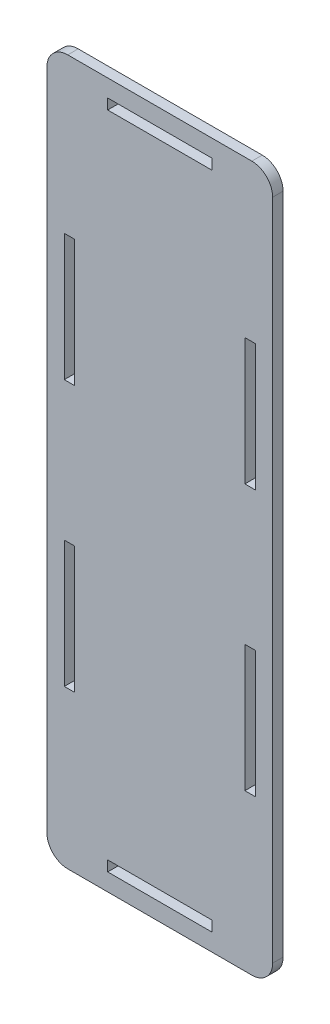
ISO-10303-21;
HEADER;
FILE_DESCRIPTION(('STEP AP214'),'2;1');
FILE_NAME('part.step','',(''),(''),'','','');
FILE_SCHEMA(('AUTOMOTIVE_DESIGN { 1 0 10303 214 1 1 1 1 }'));
ENDSEC;
DATA;
#1=APPLICATION_CONTEXT('core data for automotive mechanical design processes');
#2=APPLICATION_PROTOCOL_DEFINITION('international standard','automotive_design',2000,#1);
#3=PRODUCT_CONTEXT('',#1,'mechanical');
#4=PRODUCT('Part','Part','',(#3));
#5=PRODUCT_RELATED_PRODUCT_CATEGORY('part','',(#4));
#6=PRODUCT_DEFINITION_FORMATION('','',#4);
#7=PRODUCT_DEFINITION_CONTEXT('part definition',#1,'design');
#8=PRODUCT_DEFINITION('design','',#6,#7);
#9=PRODUCT_DEFINITION_SHAPE('','',#8);
#10=(LENGTH_UNIT() NAMED_UNIT(*) SI_UNIT(.MILLI.,.METRE.));
#11=(NAMED_UNIT(*) PLANE_ANGLE_UNIT() SI_UNIT($,.RADIAN.));
#12=(NAMED_UNIT(*) SI_UNIT($,.STERADIAN.) SOLID_ANGLE_UNIT());
#13=UNCERTAINTY_MEASURE_WITH_UNIT(LENGTH_MEASURE(1.E-05),#10,'distance_accuracy_value','');
#14=(GEOMETRIC_REPRESENTATION_CONTEXT(3) GLOBAL_UNCERTAINTY_ASSIGNED_CONTEXT((#13)) GLOBAL_UNIT_ASSIGNED_CONTEXT((#10,
#11,#12)) REPRESENTATION_CONTEXT('',''));
#15=CARTESIAN_POINT('',(0.,0.,0.));
#16=DIRECTION('',(0.,0.,1.));
#17=DIRECTION('',(1.,0.,0.));
#18=AXIS2_PLACEMENT_3D('',#15,#16,#17);
#19=CARTESIAN_POINT('',(26.5,95.5,3.));
#20=DIRECTION('',(0.,0.,-1.));
#21=DIRECTION('',(-1.,0.,0.));
#22=AXIS2_PLACEMENT_3D('',#19,#20,#21);
#23=PLANE('',#22);
#24=DIRECTION('',(0.,1.,0.));
#25=VECTOR('',#24,1.);
#26=CARTESIAN_POINT('',(-15.,-96.5,3.));
#27=LINE('',#26,#25);
#28=CARTESIAN_POINT('',(-15.,-96.5,3.));
#29=VERTEX_POINT('',#28);
#30=CARTESIAN_POINT('',(-15.,-93.5,3.));
#31=VERTEX_POINT('',#30);
#32=EDGE_CURVE('E56',#29,#31,#27,.T.);
#33=ORIENTED_EDGE('',*,*,#32,.T.);
#34=DIRECTION('',(1.,0.,0.));
#35=VECTOR('',#34,1.);
#36=CARTESIAN_POINT('',(-15.,-93.5,3.));
#37=LINE('',#36,#35);
#38=CARTESIAN_POINT('',(15.,-93.5,3.));
#39=VERTEX_POINT('',#38);
#40=EDGE_CURVE('E364',#31,#39,#37,.T.);
#41=ORIENTED_EDGE('',*,*,#40,.T.);
#42=DIRECTION('',(0.,1.,0.));
#43=VECTOR('',#42,1.);
#44=CARTESIAN_POINT('',(15.,-96.5,3.));
#45=LINE('',#44,#43);
#46=CARTESIAN_POINT('',(15.,-96.5,3.));
#47=VERTEX_POINT('',#46);
#48=EDGE_CURVE('E360',#47,#39,#45,.T.);
#49=ORIENTED_EDGE('',*,*,#48,.F.);
#50=DIRECTION('',(1.,0.,0.));
#51=VECTOR('',#50,1.);
#52=CARTESIAN_POINT('',(-15.,-96.5,3.));
#53=LINE('',#52,#51);
#54=EDGE_CURVE('E357',#29,#47,#53,.T.);
#55=ORIENTED_EDGE('',*,*,#54,.F.);
#56=EDGE_LOOP('',(#33,#41,#49,#55));
#57=FACE_BOUND('',#56,.T.);
#58=DIRECTION('',(0.,1.,0.));
#59=VECTOR('',#58,1.);
#60=CARTESIAN_POINT('',(27.5,-56.5,3.));
#61=LINE('',#60,#59);
#62=CARTESIAN_POINT('',(27.5,-56.5,3.));
#63=VERTEX_POINT('',#62);
#64=CARTESIAN_POINT('',(27.5,-20.,3.));
#65=VERTEX_POINT('',#64);
#66=EDGE_CURVE('E335',#63,#65,#61,.T.);
#67=ORIENTED_EDGE('',*,*,#66,.F.);
#68=DIRECTION('',(1.,0.,0.));
#69=VECTOR('',#68,1.);
#70=CARTESIAN_POINT('',(24.5,-56.5,3.));
#71=LINE('',#70,#69);
#72=CARTESIAN_POINT('',(24.5,-56.5,3.));
#73=VERTEX_POINT('',#72);
#74=EDGE_CURVE('E290',#73,#63,#71,.T.);
#75=ORIENTED_EDGE('',*,*,#74,.F.);
#76=DIRECTION('',(0.,1.,0.));
#77=VECTOR('',#76,1.);
#78=CARTESIAN_POINT('',(24.5,-56.5,3.));
#79=LINE('',#78,#77);
#80=CARTESIAN_POINT('',(24.5,-20.,3.));
#81=VERTEX_POINT('',#80);
#82=EDGE_CURVE('E328',#73,#81,#79,.T.);
#83=ORIENTED_EDGE('',*,*,#82,.T.);
#84=DIRECTION('',(1.,0.,0.));
#85=VECTOR('',#84,1.);
#86=CARTESIAN_POINT('',(24.5,-20.,3.));
#87=LINE('',#86,#85);
#88=EDGE_CURVE('E331',#81,#65,#87,.T.);
#89=ORIENTED_EDGE('',*,*,#88,.T.);
#90=EDGE_LOOP('',(#67,#75,#83,#89));
#91=FACE_BOUND('',#90,.T.);
#92=CARTESIAN_POINT('',(26.5,95.5,3.));
#93=DIRECTION('',(0.,0.,1.));
#94=DIRECTION('',(-1.,0.,0.));
#95=AXIS2_PLACEMENT_3D('',#92,#93,#94);
#96=CIRCLE('',#95,6.);
#97=CARTESIAN_POINT('',(32.5,95.5,3.));
#98=VERTEX_POINT('',#97);
#99=CARTESIAN_POINT('',(26.4999999999999,101.5,3.));
#100=VERTEX_POINT('',#99);
#101=EDGE_CURVE('E433',#98,#100,#96,.T.);
#102=ORIENTED_EDGE('',*,*,#101,.T.);
#103=DIRECTION('',(-1.,0.,0.));
#104=VECTOR('',#103,1.);
#105=CARTESIAN_POINT('',(-26.5,101.5,3.));
#106=LINE('',#105,#104);
#107=CARTESIAN_POINT('',(-26.5,101.5,3.));
#108=VERTEX_POINT('',#107);
#109=EDGE_CURVE('E436',#100,#108,#106,.T.);
#110=ORIENTED_EDGE('',*,*,#109,.T.);
#111=CARTESIAN_POINT('',(-26.5,95.5,3.));
#112=DIRECTION('',(0.,0.,1.));
#113=DIRECTION('',(-1.,0.,0.));
#114=AXIS2_PLACEMENT_3D('',#111,#112,#113);
#115=CIRCLE('',#114,6.);
#116=CARTESIAN_POINT('',(-32.5,95.5,3.));
#117=VERTEX_POINT('',#116);
#118=EDGE_CURVE('E439',#108,#117,#115,.T.);
#119=ORIENTED_EDGE('',*,*,#118,.T.);
#120=DIRECTION('',(0.,-1.,0.));
#121=VECTOR('',#120,1.);
#122=CARTESIAN_POINT('',(-32.5,95.5,3.));
#123=LINE('',#122,#121);
#124=CARTESIAN_POINT('',(-32.5,-95.5,3.));
#125=VERTEX_POINT('',#124);
#126=EDGE_CURVE('E441',#117,#125,#123,.T.);
#127=ORIENTED_EDGE('',*,*,#126,.T.);
#128=CARTESIAN_POINT('',(-26.5,-95.5,3.));
#129=DIRECTION('',(0.,0.,1.));
#130=DIRECTION('',(-1.,0.,0.));
#131=AXIS2_PLACEMENT_3D('',#128,#129,#130);
#132=CIRCLE('',#131,6.);
#133=CARTESIAN_POINT('',(-26.5,-101.5,3.));
#134=VERTEX_POINT('',#133);
#135=EDGE_CURVE('E443',#125,#134,#132,.T.);
#136=ORIENTED_EDGE('',*,*,#135,.T.);
#137=DIRECTION('',(1.,0.,0.));
#138=VECTOR('',#137,1.);
#139=CARTESIAN_POINT('',(-26.5,-101.5,3.));
#140=LINE('',#139,#138);
#141=CARTESIAN_POINT('',(26.5,-101.5,3.));
#142=VERTEX_POINT('',#141);
#143=EDGE_CURVE('E445',#134,#142,#140,.T.);
#144=ORIENTED_EDGE('',*,*,#143,.T.);
#145=CARTESIAN_POINT('',(26.5,-95.5,3.));
#146=DIRECTION('',(0.,0.,1.));
#147=DIRECTION('',(1.,0.,0.));
#148=AXIS2_PLACEMENT_3D('',#145,#146,#147);
#149=CIRCLE('',#148,6.);
#150=CARTESIAN_POINT('',(32.5,-95.5,3.));
#151=VERTEX_POINT('',#150);
#152=EDGE_CURVE('E447',#142,#151,#149,.T.);
#153=ORIENTED_EDGE('',*,*,#152,.T.);
#154=DIRECTION('',(0.,1.,0.));
#155=VECTOR('',#154,1.);
#156=CARTESIAN_POINT('',(32.5,95.5,3.));
#157=LINE('',#156,#155);
#158=EDGE_CURVE('E449',#151,#98,#157,.T.);
#159=ORIENTED_EDGE('',*,*,#158,.T.);
#160=EDGE_LOOP('',(#102,#110,#119,#127,#136,#144,#153,#159));
#161=FACE_BOUND('',#160,.T.);
#162=DIRECTION('',(0.,-1.,0.));
#163=VECTOR('',#162,1.);
#164=CARTESIAN_POINT('',(-27.5,56.5,3.));
#165=LINE('',#164,#163);
#166=CARTESIAN_POINT('',(-27.5,56.5,3.));
#167=VERTEX_POINT('',#166);
#168=CARTESIAN_POINT('',(-27.5,20.,3.));
#169=VERTEX_POINT('',#168);
#170=EDGE_CURVE('E271',#167,#169,#165,.T.);
#171=ORIENTED_EDGE('',*,*,#170,.F.);
#172=DIRECTION('',(-1.,0.,0.));
#173=VECTOR('',#172,1.);
#174=CARTESIAN_POINT('',(-24.5,56.5,3.));
#175=LINE('',#174,#173);
#176=CARTESIAN_POINT('',(-24.5,56.5,3.));
#177=VERTEX_POINT('',#176);
#178=EDGE_CURVE('E269',#177,#167,#175,.T.);
#179=ORIENTED_EDGE('',*,*,#178,.F.);
#180=DIRECTION('',(0.,-1.,0.));
#181=VECTOR('',#180,1.);
#182=CARTESIAN_POINT('',(-24.5,56.5,3.));
#183=LINE('',#182,#181);
#184=CARTESIAN_POINT('',(-24.5,20.,3.));
#185=VERTEX_POINT('',#184);
#186=EDGE_CURVE('E408',#177,#185,#183,.T.);
#187=ORIENTED_EDGE('',*,*,#186,.T.);
#188=DIRECTION('',(-1.,0.,0.));
#189=VECTOR('',#188,1.);
#190=CARTESIAN_POINT('',(-24.5,20.,3.));
#191=LINE('',#190,#189);
#192=EDGE_CURVE('E419',#185,#169,#191,.T.);
#193=ORIENTED_EDGE('',*,*,#192,.T.);
#194=EDGE_LOOP('',(#171,#179,#187,#193));
#195=FACE_BOUND('',#194,.T.);
#196=DIRECTION('',(1.,0.,0.));
#197=VECTOR('',#196,1.);
#198=CARTESIAN_POINT('',(-15.,93.5,3.));
#199=LINE('',#198,#197);
#200=CARTESIAN_POINT('',(-15.,93.5,3.));
#201=VERTEX_POINT('',#200);
#202=CARTESIAN_POINT('',(15.,93.5,3.));
#203=VERTEX_POINT('',#202);
#204=EDGE_CURVE('E268',#201,#203,#199,.T.);
#205=ORIENTED_EDGE('',*,*,#204,.F.);
#206=DIRECTION('',(0.,-1.,0.));
#207=VECTOR('',#206,1.);
#208=CARTESIAN_POINT('',(-15.,96.5,3.));
#209=LINE('',#208,#207);
#210=CARTESIAN_POINT('',(-15.,96.5,3.));
#211=VERTEX_POINT('',#210);
#212=EDGE_CURVE('E247',#211,#201,#209,.T.);
#213=ORIENTED_EDGE('',*,*,#212,.F.);
#214=DIRECTION('',(1.,0.,0.));
#215=VECTOR('',#214,1.);
#216=CARTESIAN_POINT('',(-15.,96.5,3.));
#217=LINE('',#216,#215);
#218=CARTESIAN_POINT('',(15.,96.5,3.));
#219=VERTEX_POINT('',#218);
#220=EDGE_CURVE('E257',#211,#219,#217,.T.);
#221=ORIENTED_EDGE('',*,*,#220,.T.);
#222=DIRECTION('',(0.,-1.,0.));
#223=VECTOR('',#222,1.);
#224=CARTESIAN_POINT('',(15.,96.5,3.));
#225=LINE('',#224,#223);
#226=EDGE_CURVE('E263',#219,#203,#225,.T.);
#227=ORIENTED_EDGE('',*,*,#226,.T.);
#228=EDGE_LOOP('',(#205,#213,#221,#227));
#229=FACE_BOUND('',#228,.T.);
#230=DIRECTION('',(1.,0.,0.));
#231=VECTOR('',#230,1.);
#232=CARTESIAN_POINT('',(24.5,56.5,3.));
#233=LINE('',#232,#231);
#234=CARTESIAN_POINT('',(24.5,56.5,3.));
#235=VERTEX_POINT('',#234);
#236=CARTESIAN_POINT('',(27.5,56.5,3.));
#237=VERTEX_POINT('',#236);
#238=EDGE_CURVE('E254',#235,#237,#233,.T.);
#239=ORIENTED_EDGE('',*,*,#238,.T.);
#240=DIRECTION('',(0.,-1.,0.));
#241=VECTOR('',#240,1.);
#242=CARTESIAN_POINT('',(27.5,56.5,3.));
#243=LINE('',#242,#241);
#244=CARTESIAN_POINT('',(27.5,20.,3.));
#245=VERTEX_POINT('',#244);
#246=EDGE_CURVE('E305',#237,#245,#243,.T.);
#247=ORIENTED_EDGE('',*,*,#246,.T.);
#248=DIRECTION('',(1.,0.,0.));
#249=VECTOR('',#248,1.);
#250=CARTESIAN_POINT('',(24.5,20.,3.));
#251=LINE('',#250,#249);
#252=CARTESIAN_POINT('',(24.5,20.,3.));
#253=VERTEX_POINT('',#252);
#254=EDGE_CURVE('E301',#253,#245,#251,.T.);
#255=ORIENTED_EDGE('',*,*,#254,.F.);
#256=DIRECTION('',(0.,-1.,0.));
#257=VECTOR('',#256,1.);
#258=CARTESIAN_POINT('',(24.5,56.5,3.));
#259=LINE('',#258,#257);
#260=EDGE_CURVE('E298',#235,#253,#259,.T.);
#261=ORIENTED_EDGE('',*,*,#260,.F.);
#262=EDGE_LOOP('',(#239,#247,#255,#261));
#263=FACE_BOUND('',#262,.T.);
#264=DIRECTION('',(-1.,0.,0.));
#265=VECTOR('',#264,1.);
#266=CARTESIAN_POINT('',(-24.5,-56.5,3.));
#267=LINE('',#266,#265);
#268=CARTESIAN_POINT('',(-24.5,-56.5,3.));
#269=VERTEX_POINT('',#268);
#270=CARTESIAN_POINT('',(-27.5,-56.5,3.));
#271=VERTEX_POINT('',#270);
#272=EDGE_CURVE('E48',#269,#271,#267,.T.);
#273=ORIENTED_EDGE('',*,*,#272,.T.);
#274=DIRECTION('',(0.,1.,0.));
#275=VECTOR('',#274,1.);
#276=CARTESIAN_POINT('',(-27.5,-56.5,3.));
#277=LINE('',#276,#275);
#278=CARTESIAN_POINT('',(-27.5,-20.,3.));
#279=VERTEX_POINT('',#278);
#280=EDGE_CURVE('E392',#271,#279,#277,.T.);
#281=ORIENTED_EDGE('',*,*,#280,.T.);
#282=DIRECTION('',(-1.,0.,0.));
#283=VECTOR('',#282,1.);
#284=CARTESIAN_POINT('',(-24.5,-20.,3.));
#285=LINE('',#284,#283);
#286=CARTESIAN_POINT('',(-24.5,-20.,3.));
#287=VERTEX_POINT('',#286);
#288=EDGE_CURVE('E388',#287,#279,#285,.T.);
#289=ORIENTED_EDGE('',*,*,#288,.F.);
#290=DIRECTION('',(0.,1.,0.));
#291=VECTOR('',#290,1.);
#292=CARTESIAN_POINT('',(-24.5,-56.5,3.));
#293=LINE('',#292,#291);
#294=EDGE_CURVE('E385',#269,#287,#293,.T.);
#295=ORIENTED_EDGE('',*,*,#294,.F.);
#296=EDGE_LOOP('',(#273,#281,#289,#295));
#297=FACE_BOUND('',#296,.T.);
#298=ADVANCED_FACE('F33',(#57,#91,#161,#195,#229,#263,#297),#23,.F.);
#299=CARTESIAN_POINT('',(26.5,95.5,0.));
#300=DIRECTION('',(0.,0.,-1.));
#301=DIRECTION('',(-1.,0.,0.));
#302=AXIS2_PLACEMENT_3D('',#299,#300,#301);
#303=PLANE('',#302);
#304=DIRECTION('',(1.,0.,0.));
#305=VECTOR('',#304,1.);
#306=CARTESIAN_POINT('',(24.5,-56.5,0.));
#307=LINE('',#306,#305);
#308=CARTESIAN_POINT('',(24.5,-56.5,0.));
#309=VERTEX_POINT('',#308);
#310=CARTESIAN_POINT('',(27.5,-56.5,0.));
#311=VERTEX_POINT('',#310);
#312=EDGE_CURVE('E332',#309,#311,#307,.T.);
#313=ORIENTED_EDGE('',*,*,#312,.T.);
#314=DIRECTION('',(0.,1.,0.));
#315=VECTOR('',#314,1.);
#316=CARTESIAN_POINT('',(27.5,-56.5,0.));
#317=LINE('',#316,#315);
#318=CARTESIAN_POINT('',(27.5,-20.,0.));
#319=VERTEX_POINT('',#318);
#320=EDGE_CURVE('E343',#311,#319,#317,.T.);
#321=ORIENTED_EDGE('',*,*,#320,.T.);
#322=DIRECTION('',(1.,0.,0.));
#323=VECTOR('',#322,1.);
#324=CARTESIAN_POINT('',(24.5,-20.,0.));
#325=LINE('',#324,#323);
#326=CARTESIAN_POINT('',(24.5,-20.,0.));
#327=VERTEX_POINT('',#326);
#328=EDGE_CURVE('E340',#327,#319,#325,.T.);
#329=ORIENTED_EDGE('',*,*,#328,.F.);
#330=DIRECTION('',(0.,1.,0.));
#331=VECTOR('',#330,1.);
#332=CARTESIAN_POINT('',(24.5,-56.5,0.));
#333=LINE('',#332,#331);
#334=EDGE_CURVE('E321',#309,#327,#333,.T.);
#335=ORIENTED_EDGE('',*,*,#334,.F.);
#336=EDGE_LOOP('',(#313,#321,#329,#335));
#337=FACE_BOUND('',#336,.T.);
#338=DIRECTION('',(0.,-1.,0.));
#339=VECTOR('',#338,1.);
#340=CARTESIAN_POINT('',(-15.,96.5,0.));
#341=LINE('',#340,#339);
#342=CARTESIAN_POINT('',(-15.,96.5,0.));
#343=VERTEX_POINT('',#342);
#344=CARTESIAN_POINT('',(-15.,93.5,0.));
#345=VERTEX_POINT('',#344);
#346=EDGE_CURVE('E250',#343,#345,#341,.T.);
#347=ORIENTED_EDGE('',*,*,#346,.T.);
#348=DIRECTION('',(1.,0.,0.));
#349=VECTOR('',#348,1.);
#350=CARTESIAN_POINT('',(-15.,93.5,0.));
#351=LINE('',#350,#349);
#352=CARTESIAN_POINT('',(15.,93.5,0.));
#353=VERTEX_POINT('',#352);
#354=EDGE_CURVE('E282',#345,#353,#351,.T.);
#355=ORIENTED_EDGE('',*,*,#354,.T.);
#356=DIRECTION('',(0.,-1.,0.));
#357=VECTOR('',#356,1.);
#358=CARTESIAN_POINT('',(15.,96.5,0.));
#359=LINE('',#358,#357);
#360=CARTESIAN_POINT('',(15.,96.5,0.));
#361=VERTEX_POINT('',#360);
#362=EDGE_CURVE('E278',#361,#353,#359,.T.);
#363=ORIENTED_EDGE('',*,*,#362,.F.);
#364=DIRECTION('',(1.,0.,0.));
#365=VECTOR('',#364,1.);
#366=CARTESIAN_POINT('',(-15.,96.5,0.));
#367=LINE('',#366,#365);
#368=EDGE_CURVE('E276',#343,#361,#367,.T.);
#369=ORIENTED_EDGE('',*,*,#368,.F.);
#370=EDGE_LOOP('',(#347,#355,#363,#369));
#371=FACE_BOUND('',#370,.T.);
#372=DIRECTION('',(-1.,0.,0.));
#373=VECTOR('',#372,1.);
#374=CARTESIAN_POINT('',(-24.5,56.5,0.));
#375=LINE('',#374,#373);
#376=CARTESIAN_POINT('',(-24.5,56.5,0.));
#377=VERTEX_POINT('',#376);
#378=CARTESIAN_POINT('',(-27.5,56.5,0.));
#379=VERTEX_POINT('',#378);
#380=EDGE_CURVE('E404',#377,#379,#375,.T.);
#381=ORIENTED_EDGE('',*,*,#380,.T.);
#382=DIRECTION('',(0.,-1.,0.));
#383=VECTOR('',#382,1.);
#384=CARTESIAN_POINT('',(-27.5,56.5,0.));
#385=LINE('',#384,#383);
#386=CARTESIAN_POINT('',(-27.5,20.,0.));
#387=VERTEX_POINT('',#386);
#388=EDGE_CURVE('E407',#379,#387,#385,.T.);
#389=ORIENTED_EDGE('',*,*,#388,.T.);
#390=DIRECTION('',(-1.,0.,0.));
#391=VECTOR('',#390,1.);
#392=CARTESIAN_POINT('',(-24.5,20.,0.));
#393=LINE('',#392,#391);
#394=CARTESIAN_POINT('',(-24.5,20.,0.));
#395=VERTEX_POINT('',#394);
#396=EDGE_CURVE('E411',#395,#387,#393,.T.);
#397=ORIENTED_EDGE('',*,*,#396,.F.);
#398=DIRECTION('',(0.,-1.,0.));
#399=VECTOR('',#398,1.);
#400=CARTESIAN_POINT('',(-24.5,56.5,0.));
#401=LINE('',#400,#399);
#402=EDGE_CURVE('E414',#377,#395,#401,.T.);
#403=ORIENTED_EDGE('',*,*,#402,.F.);
#404=EDGE_LOOP('',(#381,#389,#397,#403));
#405=FACE_BOUND('',#404,.T.);
#406=CARTESIAN_POINT('',(26.5,95.5,0.));
#407=DIRECTION('',(0.,0.,1.));
#408=DIRECTION('',(-1.,0.,0.));
#409=AXIS2_PLACEMENT_3D('',#406,#407,#408);
#410=CIRCLE('',#409,6.);
#411=CARTESIAN_POINT('',(32.5,95.5,0.));
#412=VERTEX_POINT('',#411);
#413=CARTESIAN_POINT('',(26.4999999999999,101.5,0.));
#414=VERTEX_POINT('',#413);
#415=EDGE_CURVE('E426',#412,#414,#410,.T.);
#416=ORIENTED_EDGE('',*,*,#415,.F.);
#417=DIRECTION('',(0.,1.,0.));
#418=VECTOR('',#417,1.);
#419=CARTESIAN_POINT('',(32.5,95.5,0.));
#420=LINE('',#419,#418);
#421=CARTESIAN_POINT('',(32.5,-95.5,0.));
#422=VERTEX_POINT('',#421);
#423=EDGE_CURVE('E437',#422,#412,#420,.T.);
#424=ORIENTED_EDGE('',*,*,#423,.F.);
#425=CARTESIAN_POINT('',(26.5,-95.5,0.));
#426=DIRECTION('',(0.,0.,1.));
#427=DIRECTION('',(1.,0.,0.));
#428=AXIS2_PLACEMENT_3D('',#425,#426,#427);
#429=CIRCLE('',#428,6.);
#430=CARTESIAN_POINT('',(26.5,-101.5,0.));
#431=VERTEX_POINT('',#430);
#432=EDGE_CURVE('E464',#431,#422,#429,.T.);
#433=ORIENTED_EDGE('',*,*,#432,.F.);
#434=DIRECTION('',(1.,0.,0.));
#435=VECTOR('',#434,1.);
#436=CARTESIAN_POINT('',(-26.5,-101.5,0.));
#437=LINE('',#436,#435);
#438=CARTESIAN_POINT('',(-26.5,-101.5,0.));
#439=VERTEX_POINT('',#438);
#440=EDGE_CURVE('E462',#439,#431,#437,.T.);
#441=ORIENTED_EDGE('',*,*,#440,.F.);
#442=CARTESIAN_POINT('',(-26.5,-95.5,0.));
#443=DIRECTION('',(0.,0.,1.));
#444=DIRECTION('',(-1.,0.,0.));
#445=AXIS2_PLACEMENT_3D('',#442,#443,#444);
#446=CIRCLE('',#445,6.);
#447=CARTESIAN_POINT('',(-32.5,-95.5,0.));
#448=VERTEX_POINT('',#447);
#449=EDGE_CURVE('E460',#448,#439,#446,.T.);
#450=ORIENTED_EDGE('',*,*,#449,.F.);
#451=DIRECTION('',(0.,-1.,0.));
#452=VECTOR('',#451,1.);
#453=CARTESIAN_POINT('',(-32.5,95.5,0.));
#454=LINE('',#453,#452);
#455=CARTESIAN_POINT('',(-32.5,95.5,0.));
#456=VERTEX_POINT('',#455);
#457=EDGE_CURVE('E458',#456,#448,#454,.T.);
#458=ORIENTED_EDGE('',*,*,#457,.F.);
#459=CARTESIAN_POINT('',(-26.5,95.5,0.));
#460=DIRECTION('',(0.,0.,1.));
#461=DIRECTION('',(-1.,0.,0.));
#462=AXIS2_PLACEMENT_3D('',#459,#460,#461);
#463=CIRCLE('',#462,6.);
#464=CARTESIAN_POINT('',(-26.5,101.5,0.));
#465=VERTEX_POINT('',#464);
#466=EDGE_CURVE('E456',#465,#456,#463,.T.);
#467=ORIENTED_EDGE('',*,*,#466,.F.);
#468=DIRECTION('',(-1.,0.,0.));
#469=VECTOR('',#468,1.);
#470=CARTESIAN_POINT('',(-26.5,101.5,0.));
#471=LINE('',#470,#469);
#472=EDGE_CURVE('E454',#414,#465,#471,.T.);
#473=ORIENTED_EDGE('',*,*,#472,.F.);
#474=EDGE_LOOP('',(#416,#424,#433,#441,#450,#458,#467,#473));
#475=FACE_BOUND('',#474,.T.);
#476=DIRECTION('',(0.,-1.,0.));
#477=VECTOR('',#476,1.);
#478=CARTESIAN_POINT('',(27.5,56.5,0.));
#479=LINE('',#478,#477);
#480=CARTESIAN_POINT('',(27.5,56.5,0.));
#481=VERTEX_POINT('',#480);
#482=CARTESIAN_POINT('',(27.5,20.,0.));
#483=VERTEX_POINT('',#482);
#484=EDGE_CURVE('E315',#481,#483,#479,.T.);
#485=ORIENTED_EDGE('',*,*,#484,.F.);
#486=DIRECTION('',(1.,0.,0.));
#487=VECTOR('',#486,1.);
#488=CARTESIAN_POINT('',(24.5,56.5,0.));
#489=LINE('',#488,#487);
#490=CARTESIAN_POINT('',(24.5,56.5,0.));
#491=VERTEX_POINT('',#490);
#492=EDGE_CURVE('E302',#491,#481,#489,.T.);
#493=ORIENTED_EDGE('',*,*,#492,.F.);
#494=DIRECTION('',(0.,-1.,0.));
#495=VECTOR('',#494,1.);
#496=CARTESIAN_POINT('',(24.5,56.5,0.));
#497=LINE('',#496,#495);
#498=CARTESIAN_POINT('',(24.5,20.,0.));
#499=VERTEX_POINT('',#498);
#500=EDGE_CURVE('E297',#491,#499,#497,.T.);
#501=ORIENTED_EDGE('',*,*,#500,.T.);
#502=DIRECTION('',(1.,0.,0.));
#503=VECTOR('',#502,1.);
#504=CARTESIAN_POINT('',(24.5,20.,0.));
#505=LINE('',#504,#503);
#506=EDGE_CURVE('E312',#499,#483,#505,.T.);
#507=ORIENTED_EDGE('',*,*,#506,.T.);
#508=EDGE_LOOP('',(#485,#493,#501,#507));
#509=FACE_BOUND('',#508,.T.);
#510=DIRECTION('',(1.,0.,0.));
#511=VECTOR('',#510,1.);
#512=CARTESIAN_POINT('',(-15.,-93.5,0.));
#513=LINE('',#512,#511);
#514=CARTESIAN_POINT('',(-15.,-93.5,0.));
#515=VERTEX_POINT('',#514);
#516=CARTESIAN_POINT('',(15.,-93.5,0.));
#517=VERTEX_POINT('',#516);
#518=EDGE_CURVE('E373',#515,#517,#513,.T.);
#519=ORIENTED_EDGE('',*,*,#518,.F.);
#520=DIRECTION('',(0.,1.,0.));
#521=VECTOR('',#520,1.);
#522=CARTESIAN_POINT('',(-15.,-96.5,0.));
#523=LINE('',#522,#521);
#524=CARTESIAN_POINT('',(-15.,-96.5,0.));
#525=VERTEX_POINT('',#524);
#526=EDGE_CURVE('E361',#525,#515,#523,.T.);
#527=ORIENTED_EDGE('',*,*,#526,.F.);
#528=DIRECTION('',(1.,0.,0.));
#529=VECTOR('',#528,1.);
#530=CARTESIAN_POINT('',(-15.,-96.5,0.));
#531=LINE('',#530,#529);
#532=CARTESIAN_POINT('',(15.,-96.5,0.));
#533=VERTEX_POINT('',#532);
#534=EDGE_CURVE('E356',#525,#533,#531,.T.);
#535=ORIENTED_EDGE('',*,*,#534,.T.);
#536=DIRECTION('',(0.,1.,0.));
#537=VECTOR('',#536,1.);
#538=CARTESIAN_POINT('',(15.,-96.5,0.));
#539=LINE('',#538,#537);
#540=EDGE_CURVE('E370',#533,#517,#539,.T.);
#541=ORIENTED_EDGE('',*,*,#540,.T.);
#542=EDGE_LOOP('',(#519,#527,#535,#541));
#543=FACE_BOUND('',#542,.T.);
#544=DIRECTION('',(0.,1.,0.));
#545=VECTOR('',#544,1.);
#546=CARTESIAN_POINT('',(-27.5,-56.5,0.));
#547=LINE('',#546,#545);
#548=CARTESIAN_POINT('',(-27.5,-56.5,0.));
#549=VERTEX_POINT('',#548);
#550=CARTESIAN_POINT('',(-27.5,-20.,0.));
#551=VERTEX_POINT('',#550);
#552=EDGE_CURVE('E401',#549,#551,#547,.T.);
#553=ORIENTED_EDGE('',*,*,#552,.F.);
#554=DIRECTION('',(-1.,0.,0.));
#555=VECTOR('',#554,1.);
#556=CARTESIAN_POINT('',(-24.5,-56.5,0.));
#557=LINE('',#556,#555);
#558=CARTESIAN_POINT('',(-24.5,-56.5,0.));
#559=VERTEX_POINT('',#558);
#560=EDGE_CURVE('E389',#559,#549,#557,.T.);
#561=ORIENTED_EDGE('',*,*,#560,.F.);
#562=DIRECTION('',(0.,1.,0.));
#563=VECTOR('',#562,1.);
#564=CARTESIAN_POINT('',(-24.5,-56.5,0.));
#565=LINE('',#564,#563);
#566=CARTESIAN_POINT('',(-24.5,-20.,0.));
#567=VERTEX_POINT('',#566);
#568=EDGE_CURVE('E384',#559,#567,#565,.T.);
#569=ORIENTED_EDGE('',*,*,#568,.T.);
#570=DIRECTION('',(-1.,0.,0.));
#571=VECTOR('',#570,1.);
#572=CARTESIAN_POINT('',(-24.5,-20.,0.));
#573=LINE('',#572,#571);
#574=EDGE_CURVE('E398',#567,#551,#573,.T.);
#575=ORIENTED_EDGE('',*,*,#574,.T.);
#576=EDGE_LOOP('',(#553,#561,#569,#575));
#577=FACE_BOUND('',#576,.T.);
#578=ADVANCED_FACE('F494',(#337,#371,#405,#475,#509,#543,#577),#303,.T.);
#579=CARTESIAN_POINT('',(26.5,95.5,3.));
#580=DIRECTION('',(0.,0.,-1.));
#581=DIRECTION('',(-1.,0.,0.));
#582=AXIS2_PLACEMENT_3D('',#579,#580,#581);
#583=CYLINDRICAL_SURFACE('',#582,6.);
#584=ORIENTED_EDGE('',*,*,#415,.T.);
#585=DIRECTION('',(0.,0.,-1.));
#586=VECTOR('',#585,1.);
#587=CARTESIAN_POINT('',(26.4999999999999,101.5,3.));
#588=LINE('',#587,#586);
#589=EDGE_CURVE('E11',#100,#414,#588,.T.);
#590=ORIENTED_EDGE('',*,*,#589,.F.);
#591=ORIENTED_EDGE('',*,*,#101,.F.);
#592=DIRECTION('',(0.,0.,-1.));
#593=VECTOR('',#592,1.);
#594=CARTESIAN_POINT('',(32.5,95.5,3.));
#595=LINE('',#594,#593);
#596=EDGE_CURVE('E451',#98,#412,#595,.T.);
#597=ORIENTED_EDGE('',*,*,#596,.T.);
#598=EDGE_LOOP('',(#584,#590,#591,#597));
#599=FACE_BOUND('',#598,.T.);
#600=ADVANCED_FACE('F35',(#599),#583,.T.);
#601=CARTESIAN_POINT('',(-26.5,101.5,3.));
#602=DIRECTION('',(0.,-1.,0.));
#603=DIRECTION('',(0.,0.,-1.));
#604=AXIS2_PLACEMENT_3D('',#601,#602,#603);
#605=PLANE('',#604);
#606=ORIENTED_EDGE('',*,*,#472,.T.);
#607=DIRECTION('',(0.,0.,-1.));
#608=VECTOR('',#607,1.);
#609=CARTESIAN_POINT('',(-26.5,101.5,3.));
#610=LINE('',#609,#608);
#611=EDGE_CURVE('E41',#108,#465,#610,.T.);
#612=ORIENTED_EDGE('',*,*,#611,.F.);
#613=ORIENTED_EDGE('',*,*,#109,.F.);
#614=ORIENTED_EDGE('',*,*,#589,.T.);
#615=EDGE_LOOP('',(#606,#612,#613,#614));
#616=FACE_BOUND('',#615,.T.);
#617=ADVANCED_FACE('F512',(#616),#605,.F.);
#618=CARTESIAN_POINT('',(-26.5,95.5,3.));
#619=DIRECTION('',(0.,0.,-1.));
#620=DIRECTION('',(-1.,0.,0.));
#621=AXIS2_PLACEMENT_3D('',#618,#619,#620);
#622=CYLINDRICAL_SURFACE('',#621,6.);
#623=ORIENTED_EDGE('',*,*,#466,.T.);
#624=DIRECTION('',(0.,0.,-1.));
#625=VECTOR('',#624,1.);
#626=CARTESIAN_POINT('',(-32.5,95.5,3.));
#627=LINE('',#626,#625);
#628=EDGE_CURVE('E481',#117,#456,#627,.T.);
#629=ORIENTED_EDGE('',*,*,#628,.F.);
#630=ORIENTED_EDGE('',*,*,#118,.F.);
#631=ORIENTED_EDGE('',*,*,#611,.T.);
#632=EDGE_LOOP('',(#623,#629,#630,#631));
#633=FACE_BOUND('',#632,.T.);
#634=ADVANCED_FACE('F488',(#633),#622,.T.);
#635=CARTESIAN_POINT('',(-32.5,95.5,3.));
#636=DIRECTION('',(1.,0.,0.));
#637=DIRECTION('',(0.,1.,0.));
#638=AXIS2_PLACEMENT_3D('',#635,#636,#637);
#639=PLANE('',#638);
#640=ORIENTED_EDGE('',*,*,#457,.T.);
#641=DIRECTION('',(0.,0.,-1.));
#642=VECTOR('',#641,1.);
#643=CARTESIAN_POINT('',(-32.5,-95.5,3.));
#644=LINE('',#643,#642);
#645=EDGE_CURVE('E478',#125,#448,#644,.T.);
#646=ORIENTED_EDGE('',*,*,#645,.F.);
#647=ORIENTED_EDGE('',*,*,#126,.F.);
#648=ORIENTED_EDGE('',*,*,#628,.T.);
#649=EDGE_LOOP('',(#640,#646,#647,#648));
#650=FACE_BOUND('',#649,.T.);
#651=ADVANCED_FACE('F500',(#650),#639,.F.);
#652=CARTESIAN_POINT('',(-26.5,-95.5,3.));
#653=DIRECTION('',(0.,0.,-1.));
#654=DIRECTION('',(-1.,0.,0.));
#655=AXIS2_PLACEMENT_3D('',#652,#653,#654);
#656=CYLINDRICAL_SURFACE('',#655,6.);
#657=ORIENTED_EDGE('',*,*,#449,.T.);
#658=DIRECTION('',(0.,0.,-1.));
#659=VECTOR('',#658,1.);
#660=CARTESIAN_POINT('',(-26.5,-101.5,3.));
#661=LINE('',#660,#659);
#662=EDGE_CURVE('E475',#134,#439,#661,.T.);
#663=ORIENTED_EDGE('',*,*,#662,.F.);
#664=ORIENTED_EDGE('',*,*,#135,.F.);
#665=ORIENTED_EDGE('',*,*,#645,.T.);
#666=EDGE_LOOP('',(#657,#663,#664,#665));
#667=FACE_BOUND('',#666,.T.);
#668=ADVANCED_FACE('F504',(#667),#656,.T.);
#669=CARTESIAN_POINT('',(-26.5,-101.5,3.));
#670=DIRECTION('',(0.,1.,0.));
#671=DIRECTION('',(0.,0.,1.));
#672=AXIS2_PLACEMENT_3D('',#669,#670,#671);
#673=PLANE('',#672);
#674=ORIENTED_EDGE('',*,*,#440,.T.);
#675=DIRECTION('',(0.,0.,-1.));
#676=VECTOR('',#675,1.);
#677=CARTESIAN_POINT('',(26.5,-101.5,3.));
#678=LINE('',#677,#676);
#679=EDGE_CURVE('E472',#142,#431,#678,.T.);
#680=ORIENTED_EDGE('',*,*,#679,.F.);
#681=ORIENTED_EDGE('',*,*,#143,.F.);
#682=ORIENTED_EDGE('',*,*,#662,.T.);
#683=EDGE_LOOP('',(#674,#680,#681,#682));
#684=FACE_BOUND('',#683,.T.);
#685=ADVANCED_FACE('F525',(#684),#673,.F.);
#686=CARTESIAN_POINT('',(26.5,-95.5,3.));
#687=DIRECTION('',(0.,0.,-1.));
#688=DIRECTION('',(-1.,0.,0.));
#689=AXIS2_PLACEMENT_3D('',#686,#687,#688);
#690=CYLINDRICAL_SURFACE('',#689,6.);
#691=ORIENTED_EDGE('',*,*,#432,.T.);
#692=DIRECTION('',(0.,0.,-1.));
#693=VECTOR('',#692,1.);
#694=CARTESIAN_POINT('',(32.5,-95.5,3.));
#695=LINE('',#694,#693);
#696=EDGE_CURVE('E469',#151,#422,#695,.T.);
#697=ORIENTED_EDGE('',*,*,#696,.F.);
#698=ORIENTED_EDGE('',*,*,#152,.F.);
#699=ORIENTED_EDGE('',*,*,#679,.T.);
#700=EDGE_LOOP('',(#691,#697,#698,#699));
#701=FACE_BOUND('',#700,.T.);
#702=ADVANCED_FACE('F523',(#701),#690,.T.);
#703=CARTESIAN_POINT('',(32.5,95.5,3.));
#704=DIRECTION('',(-1.,0.,0.));
#705=DIRECTION('',(0.,-1.,0.));
#706=AXIS2_PLACEMENT_3D('',#703,#704,#705);
#707=PLANE('',#706);
#708=ORIENTED_EDGE('',*,*,#423,.T.);
#709=ORIENTED_EDGE('',*,*,#596,.F.);
#710=ORIENTED_EDGE('',*,*,#158,.F.);
#711=ORIENTED_EDGE('',*,*,#696,.T.);
#712=EDGE_LOOP('',(#708,#709,#710,#711));
#713=FACE_BOUND('',#712,.T.);
#714=ADVANCED_FACE('F518',(#713),#707,.F.);
#715=CARTESIAN_POINT('',(-24.5,56.5,0.));
#716=DIRECTION('',(0.,1.,0.));
#717=DIRECTION('',(-1.,0.,0.));
#718=AXIS2_PLACEMENT_3D('',#715,#716,#717);
#719=PLANE('',#718);
#720=ORIENTED_EDGE('',*,*,#178,.T.);
#721=DIRECTION('',(0.,0.,1.));
#722=VECTOR('',#721,1.);
#723=CARTESIAN_POINT('',(-27.5,56.5,0.));
#724=LINE('',#723,#722);
#725=EDGE_CURVE('E415',#379,#167,#724,.T.);
#726=ORIENTED_EDGE('',*,*,#725,.F.);
#727=ORIENTED_EDGE('',*,*,#380,.F.);
#728=DIRECTION('',(0.,0.,1.));
#729=VECTOR('',#728,1.);
#730=CARTESIAN_POINT('',(-24.5,56.5,0.));
#731=LINE('',#730,#729);
#732=EDGE_CURVE('E424',#377,#177,#731,.T.);
#733=ORIENTED_EDGE('',*,*,#732,.T.);
#734=EDGE_LOOP('',(#720,#726,#727,#733));
#735=FACE_BOUND('',#734,.T.);
#736=ADVANCED_FACE('F544',(#735),#719,.F.);
#737=CARTESIAN_POINT('',(-24.5,56.5,0.));
#738=DIRECTION('',(-1.,0.,0.));
#739=DIRECTION('',(0.,-1.,0.));
#740=AXIS2_PLACEMENT_3D('',#737,#738,#739);
#741=PLANE('',#740);
#742=ORIENTED_EDGE('',*,*,#186,.F.);
#743=ORIENTED_EDGE('',*,*,#732,.F.);
#744=ORIENTED_EDGE('',*,*,#402,.T.);
#745=DIRECTION('',(0.,0.,1.));
#746=VECTOR('',#745,1.);
#747=CARTESIAN_POINT('',(-24.5,20.,0.));
#748=LINE('',#747,#746);
#749=EDGE_CURVE('E427',#395,#185,#748,.T.);
#750=ORIENTED_EDGE('',*,*,#749,.T.);
#751=EDGE_LOOP('',(#742,#743,#744,#750));
#752=FACE_BOUND('',#751,.T.);
#753=ADVANCED_FACE('F551',(#752),#741,.T.);
#754=CARTESIAN_POINT('',(-24.5,20.,0.));
#755=DIRECTION('',(0.,1.,0.));
#756=DIRECTION('',(0.,0.,1.));
#757=AXIS2_PLACEMENT_3D('',#754,#755,#756);
#758=PLANE('',#757);
#759=ORIENTED_EDGE('',*,*,#192,.F.);
#760=ORIENTED_EDGE('',*,*,#749,.F.);
#761=ORIENTED_EDGE('',*,*,#396,.T.);
#762=DIRECTION('',(0.,0.,1.));
#763=VECTOR('',#762,1.);
#764=CARTESIAN_POINT('',(-27.5,20.,0.));
#765=LINE('',#764,#763);
#766=EDGE_CURVE('E429',#387,#169,#765,.T.);
#767=ORIENTED_EDGE('',*,*,#766,.T.);
#768=EDGE_LOOP('',(#759,#760,#761,#767));
#769=FACE_BOUND('',#768,.T.);
#770=ADVANCED_FACE('F556',(#769),#758,.T.);
#771=CARTESIAN_POINT('',(-27.5,56.5,0.));
#772=DIRECTION('',(-1.,0.,0.));
#773=DIRECTION('',(0.,-1.,0.));
#774=AXIS2_PLACEMENT_3D('',#771,#772,#773);
#775=PLANE('',#774);
#776=ORIENTED_EDGE('',*,*,#170,.T.);
#777=ORIENTED_EDGE('',*,*,#766,.F.);
#778=ORIENTED_EDGE('',*,*,#388,.F.);
#779=ORIENTED_EDGE('',*,*,#725,.T.);
#780=EDGE_LOOP('',(#776,#777,#778,#779));
#781=FACE_BOUND('',#780,.T.);
#782=ADVANCED_FACE('F565',(#781),#775,.F.);
#783=CARTESIAN_POINT('',(-15.,96.5,0.));
#784=DIRECTION('',(-1.,0.,0.));
#785=DIRECTION('',(0.,0.,1.));
#786=AXIS2_PLACEMENT_3D('',#783,#784,#785);
#787=PLANE('',#786);
#788=ORIENTED_EDGE('',*,*,#212,.T.);
#789=DIRECTION('',(0.,0.,1.));
#790=VECTOR('',#789,1.);
#791=CARTESIAN_POINT('',(-15.,93.5,0.));
#792=LINE('',#791,#790);
#793=EDGE_CURVE('E279',#345,#201,#792,.T.);
#794=ORIENTED_EDGE('',*,*,#793,.F.);
#795=ORIENTED_EDGE('',*,*,#346,.F.);
#796=DIRECTION('',(0.,0.,1.));
#797=VECTOR('',#796,1.);
#798=CARTESIAN_POINT('',(-15.,96.5,0.));
#799=LINE('',#798,#797);
#800=EDGE_CURVE('E243',#343,#211,#799,.T.);
#801=ORIENTED_EDGE('',*,*,#800,.T.);
#802=EDGE_LOOP('',(#788,#794,#795,#801));
#803=FACE_BOUND('',#802,.T.);
#804=ADVANCED_FACE('F245',(#803),#787,.F.);
#805=CARTESIAN_POINT('',(-15.,96.5,0.));
#806=DIRECTION('',(0.,-1.,0.));
#807=DIRECTION('',(0.,0.,-1.));
#808=AXIS2_PLACEMENT_3D('',#805,#806,#807);
#809=PLANE('',#808);
#810=ORIENTED_EDGE('',*,*,#220,.F.);
#811=ORIENTED_EDGE('',*,*,#800,.F.);
#812=ORIENTED_EDGE('',*,*,#368,.T.);
#813=DIRECTION('',(0.,0.,1.));
#814=VECTOR('',#813,1.);
#815=CARTESIAN_POINT('',(15.,96.5,0.));
#816=LINE('',#815,#814);
#817=EDGE_CURVE('E253',#361,#219,#816,.T.);
#818=ORIENTED_EDGE('',*,*,#817,.T.);
#819=EDGE_LOOP('',(#810,#811,#812,#818));
#820=FACE_BOUND('',#819,.T.);
#821=ADVANCED_FACE('F258',(#820),#809,.T.);
#822=CARTESIAN_POINT('',(15.,96.5,0.));
#823=DIRECTION('',(-1.,0.,0.));
#824=DIRECTION('',(0.,0.,1.));
#825=AXIS2_PLACEMENT_3D('',#822,#823,#824);
#826=PLANE('',#825);
#827=ORIENTED_EDGE('',*,*,#226,.F.);
#828=ORIENTED_EDGE('',*,*,#817,.F.);
#829=ORIENTED_EDGE('',*,*,#362,.T.);
#830=DIRECTION('',(0.,0.,1.));
#831=VECTOR('',#830,1.);
#832=CARTESIAN_POINT('',(15.,93.5,0.));
#833=LINE('',#832,#831);
#834=EDGE_CURVE('E852',#353,#203,#833,.T.);
#835=ORIENTED_EDGE('',*,*,#834,.T.);
#836=EDGE_LOOP('',(#827,#828,#829,#835));
#837=FACE_BOUND('',#836,.T.);
#838=ADVANCED_FACE('F643',(#837),#826,.T.);
#839=CARTESIAN_POINT('',(-15.,93.5,0.));
#840=DIRECTION('',(0.,-1.,0.));
#841=DIRECTION('',(0.,0.,-1.));
#842=AXIS2_PLACEMENT_3D('',#839,#840,#841);
#843=PLANE('',#842);
#844=ORIENTED_EDGE('',*,*,#204,.T.);
#845=ORIENTED_EDGE('',*,*,#834,.F.);
#846=ORIENTED_EDGE('',*,*,#354,.F.);
#847=ORIENTED_EDGE('',*,*,#793,.T.);
#848=EDGE_LOOP('',(#844,#845,#846,#847));
#849=FACE_BOUND('',#848,.T.);
#850=ADVANCED_FACE('F639',(#849),#843,.F.);
#851=CARTESIAN_POINT('',(24.5,56.5,0.));
#852=DIRECTION('',(0.,-1.,0.));
#853=DIRECTION('',(0.,0.,-1.));
#854=AXIS2_PLACEMENT_3D('',#851,#852,#853);
#855=PLANE('',#854);
#856=ORIENTED_EDGE('',*,*,#238,.F.);
#857=DIRECTION('',(0.,0.,1.));
#858=VECTOR('',#857,1.);
#859=CARTESIAN_POINT('',(24.5,56.5,0.));
#860=LINE('',#859,#858);
#861=EDGE_CURVE('E294',#491,#235,#860,.T.);
#862=ORIENTED_EDGE('',*,*,#861,.F.);
#863=ORIENTED_EDGE('',*,*,#492,.T.);
#864=DIRECTION('',(0.,0.,1.));
#865=VECTOR('',#864,1.);
#866=CARTESIAN_POINT('',(27.5,56.5,0.));
#867=LINE('',#866,#865);
#868=EDGE_CURVE('E286',#481,#237,#867,.T.);
#869=ORIENTED_EDGE('',*,*,#868,.T.);
#870=EDGE_LOOP('',(#856,#862,#863,#869));
#871=FACE_BOUND('',#870,.T.);
#872=ADVANCED_FACE('F635',(#871),#855,.T.);
#873=CARTESIAN_POINT('',(27.5,56.5,0.));
#874=DIRECTION('',(-1.,0.,0.));
#875=DIRECTION('',(0.,0.,1.));
#876=AXIS2_PLACEMENT_3D('',#873,#874,#875);
#877=PLANE('',#876);
#878=ORIENTED_EDGE('',*,*,#246,.F.);
#879=ORIENTED_EDGE('',*,*,#868,.F.);
#880=ORIENTED_EDGE('',*,*,#484,.T.);
#881=DIRECTION('',(0.,0.,1.));
#882=VECTOR('',#881,1.);
#883=CARTESIAN_POINT('',(27.5,20.,0.));
#884=LINE('',#883,#882);
#885=EDGE_CURVE('E289',#483,#245,#884,.T.);
#886=ORIENTED_EDGE('',*,*,#885,.T.);
#887=EDGE_LOOP('',(#878,#879,#880,#886));
#888=FACE_BOUND('',#887,.T.);
#889=ADVANCED_FACE('F631',(#888),#877,.T.);
#890=CARTESIAN_POINT('',(24.5,20.,0.));
#891=DIRECTION('',(0.,-1.,0.));
#892=DIRECTION('',(0.,0.,-1.));
#893=AXIS2_PLACEMENT_3D('',#890,#891,#892);
#894=PLANE('',#893);
#895=ORIENTED_EDGE('',*,*,#254,.T.);
#896=ORIENTED_EDGE('',*,*,#885,.F.);
#897=ORIENTED_EDGE('',*,*,#506,.F.);
#898=DIRECTION('',(0.,0.,1.));
#899=VECTOR('',#898,1.);
#900=CARTESIAN_POINT('',(24.5,20.,0.));
#901=LINE('',#900,#899);
#902=EDGE_CURVE('E292',#499,#253,#901,.T.);
#903=ORIENTED_EDGE('',*,*,#902,.T.);
#904=EDGE_LOOP('',(#895,#896,#897,#903));
#905=FACE_BOUND('',#904,.T.);
#906=ADVANCED_FACE('F627',(#905),#894,.F.);
#907=CARTESIAN_POINT('',(24.5,56.5,0.));
#908=DIRECTION('',(-1.,0.,0.));
#909=DIRECTION('',(0.,0.,1.));
#910=AXIS2_PLACEMENT_3D('',#907,#908,#909);
#911=PLANE('',#910);
#912=ORIENTED_EDGE('',*,*,#260,.T.);
#913=ORIENTED_EDGE('',*,*,#902,.F.);
#914=ORIENTED_EDGE('',*,*,#500,.F.);
#915=ORIENTED_EDGE('',*,*,#861,.T.);
#916=EDGE_LOOP('',(#912,#913,#914,#915));
#917=FACE_BOUND('',#916,.T.);
#918=ADVANCED_FACE('F623',(#917),#911,.F.);
#919=CARTESIAN_POINT('',(24.5,-56.5,0.));
#920=DIRECTION('',(0.,-1.,0.));
#921=DIRECTION('',(0.,0.,-1.));
#922=AXIS2_PLACEMENT_3D('',#919,#920,#921);
#923=PLANE('',#922);
#924=ORIENTED_EDGE('',*,*,#74,.T.);
#925=DIRECTION('',(0.,0.,1.));
#926=VECTOR('',#925,1.);
#927=CARTESIAN_POINT('',(27.5,-56.5,0.));
#928=LINE('',#927,#926);
#929=EDGE_CURVE('E318',#311,#63,#928,.T.);
#930=ORIENTED_EDGE('',*,*,#929,.F.);
#931=ORIENTED_EDGE('',*,*,#312,.F.);
#932=DIRECTION('',(0.,0.,1.));
#933=VECTOR('',#932,1.);
#934=CARTESIAN_POINT('',(24.5,-56.5,0.));
#935=LINE('',#934,#933);
#936=EDGE_CURVE('E326',#309,#73,#935,.T.);
#937=ORIENTED_EDGE('',*,*,#936,.T.);
#938=EDGE_LOOP('',(#924,#930,#931,#937));
#939=FACE_BOUND('',#938,.T.);
#940=ADVANCED_FACE('F613',(#939),#923,.F.);
#941=CARTESIAN_POINT('',(24.5,-56.5,0.));
#942=DIRECTION('',(1.,0.,0.));
#943=DIRECTION('',(0.,0.,-1.));
#944=AXIS2_PLACEMENT_3D('',#941,#942,#943);
#945=PLANE('',#944);
#946=ORIENTED_EDGE('',*,*,#82,.F.);
#947=ORIENTED_EDGE('',*,*,#936,.F.);
#948=ORIENTED_EDGE('',*,*,#334,.T.);
#949=DIRECTION('',(0.,0.,1.));
#950=VECTOR('',#949,1.);
#951=CARTESIAN_POINT('',(24.5,-20.,0.));
#952=LINE('',#951,#950);
#953=EDGE_CURVE('E324',#327,#81,#952,.T.);
#954=ORIENTED_EDGE('',*,*,#953,.T.);
#955=EDGE_LOOP('',(#946,#947,#948,#954));
#956=FACE_BOUND('',#955,.T.);
#957=ADVANCED_FACE('F609',(#956),#945,.T.);
#958=CARTESIAN_POINT('',(24.5,-20.,0.));
#959=DIRECTION('',(0.,-1.,0.));
#960=DIRECTION('',(0.,0.,-1.));
#961=AXIS2_PLACEMENT_3D('',#958,#959,#960);
#962=PLANE('',#961);
#963=ORIENTED_EDGE('',*,*,#88,.F.);
#964=ORIENTED_EDGE('',*,*,#953,.F.);
#965=ORIENTED_EDGE('',*,*,#328,.T.);
#966=DIRECTION('',(0.,0.,1.));
#967=VECTOR('',#966,1.);
#968=CARTESIAN_POINT('',(27.5,-20.,0.));
#969=LINE('',#968,#967);
#970=EDGE_CURVE('E322',#319,#65,#969,.T.);
#971=ORIENTED_EDGE('',*,*,#970,.T.);
#972=EDGE_LOOP('',(#963,#964,#965,#971));
#973=FACE_BOUND('',#972,.T.);
#974=ADVANCED_FACE('F612',(#973),#962,.T.);
#975=CARTESIAN_POINT('',(27.5,-56.5,0.));
#976=DIRECTION('',(1.,0.,0.));
#977=DIRECTION('',(0.,0.,-1.));
#978=AXIS2_PLACEMENT_3D('',#975,#976,#977);
#979=PLANE('',#978);
#980=ORIENTED_EDGE('',*,*,#66,.T.);
#981=ORIENTED_EDGE('',*,*,#970,.F.);
#982=ORIENTED_EDGE('',*,*,#320,.F.);
#983=ORIENTED_EDGE('',*,*,#929,.T.);
#984=EDGE_LOOP('',(#980,#981,#982,#983));
#985=FACE_BOUND('',#984,.T.);
#986=ADVANCED_FACE('F608',(#985),#979,.F.);
#987=CARTESIAN_POINT('',(-15.,-96.5,0.));
#988=DIRECTION('',(1.,0.,0.));
#989=DIRECTION('',(0.,0.,-1.));
#990=AXIS2_PLACEMENT_3D('',#987,#988,#989);
#991=PLANE('',#990);
#992=ORIENTED_EDGE('',*,*,#32,.F.);
#993=DIRECTION('',(0.,0.,1.));
#994=VECTOR('',#993,1.);
#995=CARTESIAN_POINT('',(-15.,-96.5,0.));
#996=LINE('',#995,#994);
#997=EDGE_CURVE('E354',#525,#29,#996,.T.);
#998=ORIENTED_EDGE('',*,*,#997,.F.);
#999=ORIENTED_EDGE('',*,*,#526,.T.);
#1000=DIRECTION('',(0.,0.,1.));
#1001=VECTOR('',#1000,1.);
#1002=CARTESIAN_POINT('',(-15.,-93.5,0.));
#1003=LINE('',#1002,#1001);
#1004=EDGE_CURVE('E348',#515,#31,#1003,.T.);
#1005=ORIENTED_EDGE('',*,*,#1004,.T.);
#1006=EDGE_LOOP('',(#992,#998,#999,#1005));
#1007=FACE_BOUND('',#1006,.T.);
#1008=ADVANCED_FACE('F604',(#1007),#991,.T.);
#1009=CARTESIAN_POINT('',(-15.,-93.5,0.));
#1010=DIRECTION('',(0.,-1.,0.));
#1011=DIRECTION('',(0.,0.,-1.));
#1012=AXIS2_PLACEMENT_3D('',#1009,#1010,#1011);
#1013=PLANE('',#1012);
#1014=ORIENTED_EDGE('',*,*,#40,.F.);
#1015=ORIENTED_EDGE('',*,*,#1004,.F.);
#1016=ORIENTED_EDGE('',*,*,#518,.T.);
#1017=DIRECTION('',(0.,0.,1.));
#1018=VECTOR('',#1017,1.);
#1019=CARTESIAN_POINT('',(15.,-93.5,0.));
#1020=LINE('',#1019,#1018);
#1021=EDGE_CURVE('E350',#517,#39,#1020,.T.);
#1022=ORIENTED_EDGE('',*,*,#1021,.T.);
#1023=EDGE_LOOP('',(#1014,#1015,#1016,#1022));
#1024=FACE_BOUND('',#1023,.T.);
#1025=ADVANCED_FACE('F600',(#1024),#1013,.T.);
#1026=CARTESIAN_POINT('',(15.,-96.5,0.));
#1027=DIRECTION('',(1.,0.,0.));
#1028=DIRECTION('',(0.,0.,-1.));
#1029=AXIS2_PLACEMENT_3D('',#1026,#1027,#1028);
#1030=PLANE('',#1029);
#1031=ORIENTED_EDGE('',*,*,#48,.T.);
#1032=ORIENTED_EDGE('',*,*,#1021,.F.);
#1033=ORIENTED_EDGE('',*,*,#540,.F.);
#1034=DIRECTION('',(0.,0.,1.));
#1035=VECTOR('',#1034,1.);
#1036=CARTESIAN_POINT('',(15.,-96.5,0.));
#1037=LINE('',#1036,#1035);
#1038=EDGE_CURVE('E352',#533,#47,#1037,.T.);
#1039=ORIENTED_EDGE('',*,*,#1038,.T.);
#1040=EDGE_LOOP('',(#1031,#1032,#1033,#1039));
#1041=FACE_BOUND('',#1040,.T.);
#1042=ADVANCED_FACE('F596',(#1041),#1030,.F.);
#1043=CARTESIAN_POINT('',(-15.,-96.5,0.));
#1044=DIRECTION('',(0.,-1.,0.));
#1045=DIRECTION('',(0.,0.,-1.));
#1046=AXIS2_PLACEMENT_3D('',#1043,#1044,#1045);
#1047=PLANE('',#1046);
#1048=ORIENTED_EDGE('',*,*,#54,.T.);
#1049=ORIENTED_EDGE('',*,*,#1038,.F.);
#1050=ORIENTED_EDGE('',*,*,#534,.F.);
#1051=ORIENTED_EDGE('',*,*,#997,.T.);
#1052=EDGE_LOOP('',(#1048,#1049,#1050,#1051));
#1053=FACE_BOUND('',#1052,.T.);
#1054=ADVANCED_FACE('F593',(#1053),#1047,.F.);
#1055=CARTESIAN_POINT('',(-24.5,-56.5,0.));
#1056=DIRECTION('',(0.,1.,0.));
#1057=DIRECTION('',(-1.,0.,0.));
#1058=AXIS2_PLACEMENT_3D('',#1055,#1056,#1057);
#1059=PLANE('',#1058);
#1060=ORIENTED_EDGE('',*,*,#272,.F.);
#1061=DIRECTION('',(0.,0.,1.));
#1062=VECTOR('',#1061,1.);
#1063=CARTESIAN_POINT('',(-24.5,-56.5,0.));
#1064=LINE('',#1063,#1062);
#1065=EDGE_CURVE('E382',#559,#269,#1064,.T.);
#1066=ORIENTED_EDGE('',*,*,#1065,.F.);
#1067=ORIENTED_EDGE('',*,*,#560,.T.);
#1068=DIRECTION('',(0.,0.,1.));
#1069=VECTOR('',#1068,1.);
#1070=CARTESIAN_POINT('',(-27.5,-56.5,0.));
#1071=LINE('',#1070,#1069);
#1072=EDGE_CURVE('E376',#549,#271,#1071,.T.);
#1073=ORIENTED_EDGE('',*,*,#1072,.T.);
#1074=EDGE_LOOP('',(#1060,#1066,#1067,#1073));
#1075=FACE_BOUND('',#1074,.T.);
#1076=ADVANCED_FACE('F589',(#1075),#1059,.T.);
#1077=CARTESIAN_POINT('',(-27.5,-56.5,0.));
#1078=DIRECTION('',(1.,0.,0.));
#1079=DIRECTION('',(0.,1.,0.));
#1080=AXIS2_PLACEMENT_3D('',#1077,#1078,#1079);
#1081=PLANE('',#1080);
#1082=ORIENTED_EDGE('',*,*,#280,.F.);
#1083=ORIENTED_EDGE('',*,*,#1072,.F.);
#1084=ORIENTED_EDGE('',*,*,#552,.T.);
#1085=DIRECTION('',(0.,0.,1.));
#1086=VECTOR('',#1085,1.);
#1087=CARTESIAN_POINT('',(-27.5,-20.,0.));
#1088=LINE('',#1087,#1086);
#1089=EDGE_CURVE('E378',#551,#279,#1088,.T.);
#1090=ORIENTED_EDGE('',*,*,#1089,.T.);
#1091=EDGE_LOOP('',(#1082,#1083,#1084,#1090));
#1092=FACE_BOUND('',#1091,.T.);
#1093=ADVANCED_FACE('F585',(#1092),#1081,.T.);
#1094=CARTESIAN_POINT('',(-24.5,-20.,0.));
#1095=DIRECTION('',(0.,1.,0.));
#1096=DIRECTION('',(0.,0.,1.));
#1097=AXIS2_PLACEMENT_3D('',#1094,#1095,#1096);
#1098=PLANE('',#1097);
#1099=ORIENTED_EDGE('',*,*,#288,.T.);
#1100=ORIENTED_EDGE('',*,*,#1089,.F.);
#1101=ORIENTED_EDGE('',*,*,#574,.F.);
#1102=DIRECTION('',(0.,0.,1.));
#1103=VECTOR('',#1102,1.);
#1104=CARTESIAN_POINT('',(-24.5,-20.,0.));
#1105=LINE('',#1104,#1103);
#1106=EDGE_CURVE('E380',#567,#287,#1105,.T.);
#1107=ORIENTED_EDGE('',*,*,#1106,.T.);
#1108=EDGE_LOOP('',(#1099,#1100,#1101,#1107));
#1109=FACE_BOUND('',#1108,.T.);
#1110=ADVANCED_FACE('F581',(#1109),#1098,.F.);
#1111=CARTESIAN_POINT('',(-24.5,-56.5,0.));
#1112=DIRECTION('',(1.,0.,0.));
#1113=DIRECTION('',(0.,1.,0.));
#1114=AXIS2_PLACEMENT_3D('',#1111,#1112,#1113);
#1115=PLANE('',#1114);
#1116=ORIENTED_EDGE('',*,*,#294,.T.);
#1117=ORIENTED_EDGE('',*,*,#1106,.F.);
#1118=ORIENTED_EDGE('',*,*,#568,.F.);
#1119=ORIENTED_EDGE('',*,*,#1065,.T.);
#1120=EDGE_LOOP('',(#1116,#1117,#1118,#1119));
#1121=FACE_BOUND('',#1120,.T.);
#1122=ADVANCED_FACE('F578',(#1121),#1115,.F.);
#1123=CLOSED_SHELL('',(#298,#578,#600,#617,#634,#651,#668,#685,#702,#714,#736,#753,#770,#782,
#804,#821,#838,#850,#872,#889,#906,#918,#940,#957,#974,#986,#1008,#1025,#1042,#1054,#1076,#1093,
#1110,#1122));
#1124=MANIFOLD_SOLID_BREP('B2',#1123);
#1125=ADVANCED_BREP_SHAPE_REPRESENTATION('',(#18,#1124),#14);
#1126=SHAPE_DEFINITION_REPRESENTATION(#9,#1125);
ENDSEC;
END-ISO-10303-21;
